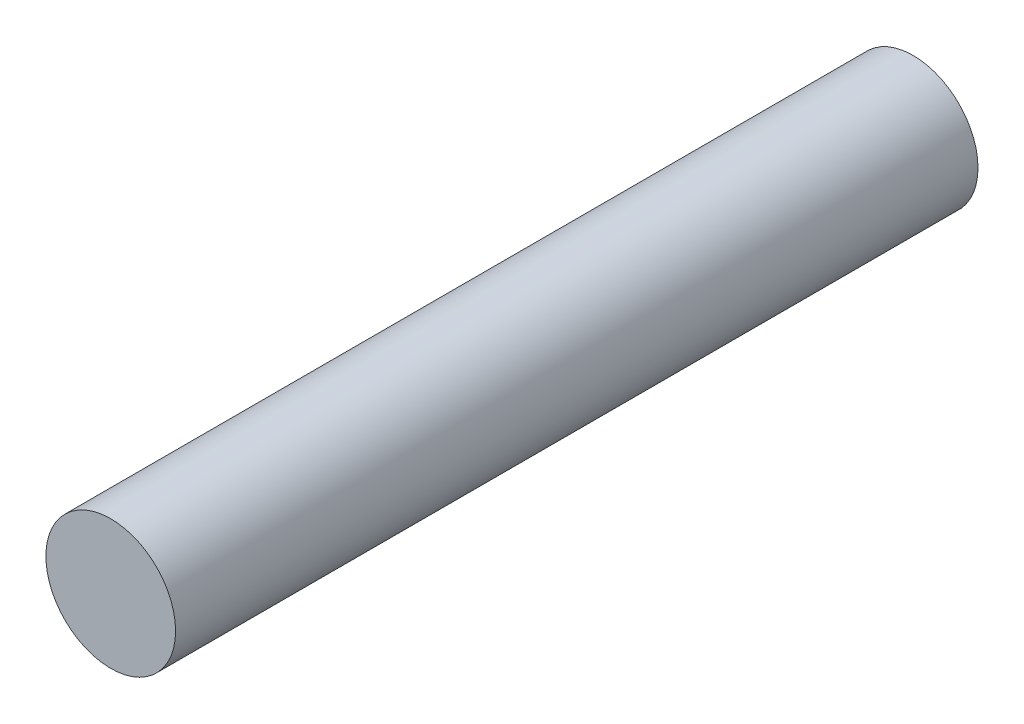
ISO-10303-21;
HEADER;
FILE_DESCRIPTION(('STEP AP214'),'2;1');
FILE_NAME('part.step','',(''),(''),'','','');
FILE_SCHEMA(('AUTOMOTIVE_DESIGN { 1 0 10303 214 1 1 1 1 }'));
ENDSEC;
DATA;
#1=APPLICATION_CONTEXT('core data for automotive mechanical design processes');
#2=APPLICATION_PROTOCOL_DEFINITION('international standard','automotive_design',2000,#1);
#3=PRODUCT_CONTEXT('',#1,'mechanical');
#4=PRODUCT('Part','Part','',(#3));
#5=PRODUCT_RELATED_PRODUCT_CATEGORY('part','',(#4));
#6=PRODUCT_DEFINITION_FORMATION('','',#4);
#7=PRODUCT_DEFINITION_CONTEXT('part definition',#1,'design');
#8=PRODUCT_DEFINITION('design','',#6,#7);
#9=PRODUCT_DEFINITION_SHAPE('','',#8);
#10=(LENGTH_UNIT() NAMED_UNIT(*) SI_UNIT(.MILLI.,.METRE.));
#11=(NAMED_UNIT(*) PLANE_ANGLE_UNIT() SI_UNIT($,.RADIAN.));
#12=(NAMED_UNIT(*) SI_UNIT($,.STERADIAN.) SOLID_ANGLE_UNIT());
#13=UNCERTAINTY_MEASURE_WITH_UNIT(LENGTH_MEASURE(1.E-05),#10,'distance_accuracy_value','');
#14=(GEOMETRIC_REPRESENTATION_CONTEXT(3) GLOBAL_UNCERTAINTY_ASSIGNED_CONTEXT((#13)) GLOBAL_UNIT_ASSIGNED_CONTEXT((#10,
#11,#12)) REPRESENTATION_CONTEXT('',''));
#15=CARTESIAN_POINT('',(0.,0.,0.));
#16=DIRECTION('',(0.,0.,1.));
#17=DIRECTION('',(1.,0.,0.));
#18=AXIS2_PLACEMENT_3D('',#15,#16,#17);
#19=CARTESIAN_POINT('',(0.,0.,330.));
#20=DIRECTION('',(0.,0.,-1.));
#21=DIRECTION('',(-1.,0.,0.));
#22=AXIS2_PLACEMENT_3D('',#19,#20,#21);
#23=CYLINDRICAL_SURFACE('',#22,26.67);
#24=CARTESIAN_POINT('',(0.,0.,330.));
#25=DIRECTION('',(0.,0.,1.));
#26=DIRECTION('',(1.,0.,0.));
#27=AXIS2_PLACEMENT_3D('',#24,#25,#26);
#28=CIRCLE('',#27,26.67);
#29=CARTESIAN_POINT('',(26.67,0.,330.));
#30=VERTEX_POINT('',#29);
#31=EDGE_CURVE('E10',#30,#30,#28,.T.);
#32=ORIENTED_EDGE('',*,*,#31,.F.);
#33=EDGE_LOOP('',(#32));
#34=FACE_BOUND('',#33,.T.);
#35=CARTESIAN_POINT('',(0.,0.,0.));
#36=DIRECTION('',(0.,0.,1.));
#37=DIRECTION('',(1.,0.,0.));
#38=AXIS2_PLACEMENT_3D('',#35,#36,#37);
#39=CIRCLE('',#38,26.67);
#40=CARTESIAN_POINT('',(26.67,0.,0.));
#41=VERTEX_POINT('',#40);
#42=EDGE_CURVE('E40',#41,#41,#39,.T.);
#43=ORIENTED_EDGE('',*,*,#42,.T.);
#44=EDGE_LOOP('',(#43));
#45=FACE_BOUND('',#44,.T.);
#46=ADVANCED_FACE('F37',(#34,#45),#23,.T.);
#47=CARTESIAN_POINT('',(0.,0.,330.));
#48=DIRECTION('',(0.,0.,1.));
#49=DIRECTION('',(1.,0.,0.));
#50=AXIS2_PLACEMENT_3D('',#47,#48,#49);
#51=PLANE('',#50);
#52=ORIENTED_EDGE('',*,*,#31,.T.);
#53=EDGE_LOOP('',(#52));
#54=FACE_BOUND('',#53,.T.);
#55=ADVANCED_FACE('F52',(#54),#51,.T.);
#56=CARTESIAN_POINT('',(0.,0.,0.));
#57=DIRECTION('',(0.,0.,1.));
#58=DIRECTION('',(1.,0.,0.));
#59=AXIS2_PLACEMENT_3D('',#56,#57,#58);
#60=PLANE('',#59);
#61=ORIENTED_EDGE('',*,*,#42,.F.);
#62=EDGE_LOOP('',(#61));
#63=FACE_BOUND('',#62,.T.);
#64=ADVANCED_FACE('F50',(#63),#60,.F.);
#65=CLOSED_SHELL('',(#46,#55,#64));
#66=MANIFOLD_SOLID_BREP('B2',#65);
#67=ADVANCED_BREP_SHAPE_REPRESENTATION('',(#18,#66),#14);
#68=SHAPE_DEFINITION_REPRESENTATION(#9,#67);
ENDSEC;
END-ISO-10303-21;
